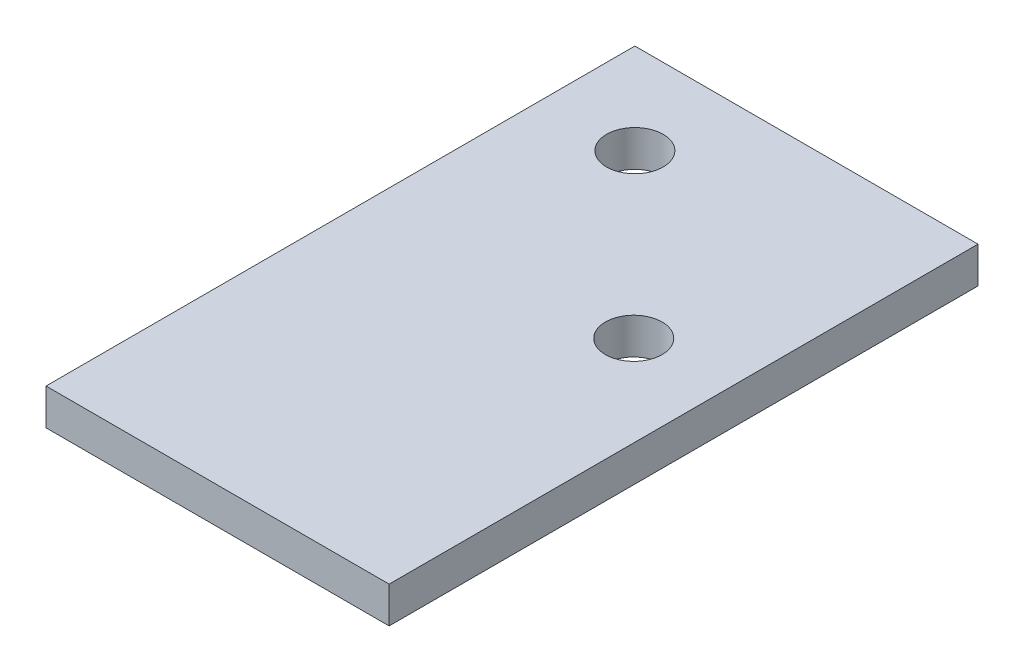
ISO-10303-21;
HEADER;
FILE_DESCRIPTION(('STEP AP214'),'2;1');
FILE_NAME('part.step','',(''),(''),'','','');
FILE_SCHEMA(('AUTOMOTIVE_DESIGN { 1 0 10303 214 1 1 1 1 }'));
ENDSEC;
DATA;
#1=APPLICATION_CONTEXT('core data for automotive mechanical design processes');
#2=APPLICATION_PROTOCOL_DEFINITION('international standard','automotive_design',2000,#1);
#3=PRODUCT_CONTEXT('',#1,'mechanical');
#4=PRODUCT('Part','Part','',(#3));
#5=PRODUCT_RELATED_PRODUCT_CATEGORY('part','',(#4));
#6=PRODUCT_DEFINITION_FORMATION('','',#4);
#7=PRODUCT_DEFINITION_CONTEXT('part definition',#1,'design');
#8=PRODUCT_DEFINITION('design','',#6,#7);
#9=PRODUCT_DEFINITION_SHAPE('','',#8);
#10=(LENGTH_UNIT() NAMED_UNIT(*) SI_UNIT(.MILLI.,.METRE.));
#11=(NAMED_UNIT(*) PLANE_ANGLE_UNIT() SI_UNIT($,.RADIAN.));
#12=(NAMED_UNIT(*) SI_UNIT($,.STERADIAN.) SOLID_ANGLE_UNIT());
#13=UNCERTAINTY_MEASURE_WITH_UNIT(LENGTH_MEASURE(1.E-05),#10,'distance_accuracy_value','');
#14=(GEOMETRIC_REPRESENTATION_CONTEXT(3) GLOBAL_UNCERTAINTY_ASSIGNED_CONTEXT((#13)) GLOBAL_UNIT_ASSIGNED_CONTEXT((#10,
#11,#12)) REPRESENTATION_CONTEXT('',''));
#15=CARTESIAN_POINT('',(0.,0.,0.));
#16=DIRECTION('',(0.,0.,1.));
#17=DIRECTION('',(1.,0.,0.));
#18=AXIS2_PLACEMENT_3D('',#15,#16,#17);
#19=CARTESIAN_POINT('',(15.15,-3.2,-26.));
#20=DIRECTION('',(1.,0.,0.));
#21=DIRECTION('',(0.,0.,-1.));
#22=AXIS2_PLACEMENT_3D('',#19,#20,#21);
#23=PLANE('',#22);
#24=DIRECTION('',(0.,0.,-1.));
#25=VECTOR('',#24,1.);
#26=CARTESIAN_POINT('',(15.15,0.,-26.));
#27=LINE('',#26,#25);
#28=CARTESIAN_POINT('',(15.15,0.,26.));
#29=VERTEX_POINT('',#28);
#30=CARTESIAN_POINT('',(15.15,0.,-26.));
#31=VERTEX_POINT('',#30);
#32=EDGE_CURVE('E122',#29,#31,#27,.T.);
#33=ORIENTED_EDGE('',*,*,#32,.F.);
#34=DIRECTION('',(0.,1.,0.));
#35=VECTOR('',#34,1.);
#36=CARTESIAN_POINT('',(15.15,-3.2,26.));
#37=LINE('',#36,#35);
#38=CARTESIAN_POINT('',(15.15,-3.2,26.));
#39=VERTEX_POINT('',#38);
#40=EDGE_CURVE('E11',#39,#29,#37,.T.);
#41=ORIENTED_EDGE('',*,*,#40,.F.);
#42=DIRECTION('',(0.,0.,-1.));
#43=VECTOR('',#42,1.);
#44=CARTESIAN_POINT('',(15.15,-3.2,-26.));
#45=LINE('',#44,#43);
#46=CARTESIAN_POINT('',(15.15,-3.2,-26.));
#47=VERTEX_POINT('',#46);
#48=EDGE_CURVE('E112',#39,#47,#45,.T.);
#49=ORIENTED_EDGE('',*,*,#48,.T.);
#50=DIRECTION('',(0.,1.,0.));
#51=VECTOR('',#50,1.);
#52=CARTESIAN_POINT('',(15.15,-3.2,-26.));
#53=LINE('',#52,#51);
#54=EDGE_CURVE('E53',#47,#31,#53,.T.);
#55=ORIENTED_EDGE('',*,*,#54,.T.);
#56=EDGE_LOOP('',(#33,#41,#49,#55));
#57=FACE_BOUND('',#56,.T.);
#58=ADVANCED_FACE('F50',(#57),#23,.T.);
#59=CARTESIAN_POINT('',(-15.15,-3.2,26.));
#60=DIRECTION('',(0.,0.,1.));
#61=DIRECTION('',(1.,0.,0.));
#62=AXIS2_PLACEMENT_3D('',#59,#60,#61);
#63=PLANE('',#62);
#64=DIRECTION('',(1.,0.,0.));
#65=VECTOR('',#64,1.);
#66=CARTESIAN_POINT('',(-15.15,0.,26.));
#67=LINE('',#66,#65);
#68=CARTESIAN_POINT('',(-15.15,0.,26.));
#69=VERTEX_POINT('',#68);
#70=EDGE_CURVE('E116',#69,#29,#67,.T.);
#71=ORIENTED_EDGE('',*,*,#70,.F.);
#72=DIRECTION('',(0.,1.,0.));
#73=VECTOR('',#72,1.);
#74=CARTESIAN_POINT('',(-15.15,-3.2,26.));
#75=LINE('',#74,#73);
#76=CARTESIAN_POINT('',(-15.15,-3.2,26.));
#77=VERTEX_POINT('',#76);
#78=EDGE_CURVE('E60',#77,#69,#75,.T.);
#79=ORIENTED_EDGE('',*,*,#78,.F.);
#80=DIRECTION('',(1.,0.,0.));
#81=VECTOR('',#80,1.);
#82=CARTESIAN_POINT('',(-15.15,-3.2,26.));
#83=LINE('',#82,#81);
#84=EDGE_CURVE('E107',#77,#39,#83,.T.);
#85=ORIENTED_EDGE('',*,*,#84,.T.);
#86=ORIENTED_EDGE('',*,*,#40,.T.);
#87=EDGE_LOOP('',(#71,#79,#85,#86));
#88=FACE_BOUND('',#87,.T.);
#89=ADVANCED_FACE('F145',(#88),#63,.T.);
#90=CARTESIAN_POINT('',(-15.15,-3.2,-26.));
#91=DIRECTION('',(-1.,0.,0.));
#92=DIRECTION('',(0.,0.,1.));
#93=AXIS2_PLACEMENT_3D('',#90,#91,#92);
#94=PLANE('',#93);
#95=DIRECTION('',(0.,0.,1.));
#96=VECTOR('',#95,1.);
#97=CARTESIAN_POINT('',(-15.15,0.,-26.));
#98=LINE('',#97,#96);
#99=CARTESIAN_POINT('',(-15.15,0.,-26.));
#100=VERTEX_POINT('',#99);
#101=EDGE_CURVE('E101',#100,#69,#98,.T.);
#102=ORIENTED_EDGE('',*,*,#101,.F.);
#103=DIRECTION('',(0.,1.,0.));
#104=VECTOR('',#103,1.);
#105=CARTESIAN_POINT('',(-15.15,-3.2,-26.));
#106=LINE('',#105,#104);
#107=CARTESIAN_POINT('',(-15.15,-3.2,-26.));
#108=VERTEX_POINT('',#107);
#109=EDGE_CURVE('E96',#108,#100,#106,.T.);
#110=ORIENTED_EDGE('',*,*,#109,.F.);
#111=DIRECTION('',(0.,0.,1.));
#112=VECTOR('',#111,1.);
#113=CARTESIAN_POINT('',(-15.15,-3.2,-26.));
#114=LINE('',#113,#112);
#115=EDGE_CURVE('E99',#108,#77,#114,.T.);
#116=ORIENTED_EDGE('',*,*,#115,.T.);
#117=ORIENTED_EDGE('',*,*,#78,.T.);
#118=EDGE_LOOP('',(#102,#110,#116,#117));
#119=FACE_BOUND('',#118,.T.);
#120=ADVANCED_FACE('F98',(#119),#94,.T.);
#121=CARTESIAN_POINT('',(-15.15,-3.2,-26.));
#122=DIRECTION('',(0.,0.,-1.));
#123=DIRECTION('',(-1.,0.,0.));
#124=AXIS2_PLACEMENT_3D('',#121,#122,#123);
#125=PLANE('',#124);
#126=DIRECTION('',(-1.,0.,0.));
#127=VECTOR('',#126,1.);
#128=CARTESIAN_POINT('',(-15.15,0.,-26.));
#129=LINE('',#128,#127);
#130=EDGE_CURVE('E126',#31,#100,#129,.T.);
#131=ORIENTED_EDGE('',*,*,#130,.F.);
#132=ORIENTED_EDGE('',*,*,#54,.F.);
#133=DIRECTION('',(-1.,0.,0.));
#134=VECTOR('',#133,1.);
#135=CARTESIAN_POINT('',(-15.15,-3.2,-26.));
#136=LINE('',#135,#134);
#137=EDGE_CURVE('E106',#47,#108,#136,.T.);
#138=ORIENTED_EDGE('',*,*,#137,.T.);
#139=ORIENTED_EDGE('',*,*,#109,.T.);
#140=EDGE_LOOP('',(#131,#132,#138,#139));
#141=FACE_BOUND('',#140,.T.);
#142=ADVANCED_FACE('F110',(#141),#125,.T.);
#143=CARTESIAN_POINT('',(0.,-3.2,0.));
#144=DIRECTION('',(0.,1.,0.));
#145=DIRECTION('',(0.,0.,1.));
#146=AXIS2_PLACEMENT_3D('',#143,#144,#145);
#147=PLANE('',#146);
#148=CARTESIAN_POINT('',(-7.15,-3.2,-18.));
#149=DIRECTION('',(0.,1.,0.));
#150=DIRECTION('',(0.,0.,1.));
#151=AXIS2_PLACEMENT_3D('',#148,#149,#150);
#152=CIRCLE('',#151,2.5);
#153=CARTESIAN_POINT('',(-7.15,-3.2,-15.5));
#154=VERTEX_POINT('',#153);
#155=EDGE_CURVE('E179',#154,#154,#152,.T.);
#156=ORIENTED_EDGE('',*,*,#155,.T.);
#157=EDGE_LOOP('',(#156));
#158=FACE_BOUND('',#157,.T.);
#159=CARTESIAN_POINT('',(7.15,-3.2,-3.59999999999999));
#160=DIRECTION('',(0.,1.,0.));
#161=DIRECTION('',(0.,0.,1.));
#162=AXIS2_PLACEMENT_3D('',#159,#160,#161);
#163=CIRCLE('',#162,2.5);
#164=CARTESIAN_POINT('',(7.15,-3.2,-1.09999999999999));
#165=VERTEX_POINT('',#164);
#166=EDGE_CURVE('E127',#165,#165,#163,.T.);
#167=ORIENTED_EDGE('',*,*,#166,.T.);
#168=EDGE_LOOP('',(#167));
#169=FACE_BOUND('',#168,.T.);
#170=ORIENTED_EDGE('',*,*,#48,.F.);
#171=ORIENTED_EDGE('',*,*,#84,.F.);
#172=ORIENTED_EDGE('',*,*,#115,.F.);
#173=ORIENTED_EDGE('',*,*,#137,.F.);
#174=EDGE_LOOP('',(#170,#171,#172,#173));
#175=FACE_BOUND('',#174,.T.);
#176=ADVANCED_FACE('F105',(#158,#169,#175),#147,.F.);
#177=CARTESIAN_POINT('',(0.,0.,0.));
#178=DIRECTION('',(0.,1.,0.));
#179=DIRECTION('',(0.,0.,1.));
#180=AXIS2_PLACEMENT_3D('',#177,#178,#179);
#181=PLANE('',#180);
#182=CARTESIAN_POINT('',(-7.15,0.,-18.));
#183=DIRECTION('',(0.,1.,0.));
#184=DIRECTION('',(0.,0.,1.));
#185=AXIS2_PLACEMENT_3D('',#182,#183,#184);
#186=CIRCLE('',#185,2.5);
#187=CARTESIAN_POINT('',(-7.15,0.,-15.5));
#188=VERTEX_POINT('',#187);
#189=EDGE_CURVE('E182',#188,#188,#186,.T.);
#190=ORIENTED_EDGE('',*,*,#189,.F.);
#191=EDGE_LOOP('',(#190));
#192=FACE_BOUND('',#191,.T.);
#193=CARTESIAN_POINT('',(7.15,0.,-3.59999999999999));
#194=DIRECTION('',(0.,1.,0.));
#195=DIRECTION('',(0.,0.,1.));
#196=AXIS2_PLACEMENT_3D('',#193,#194,#195);
#197=CIRCLE('',#196,2.5);
#198=CARTESIAN_POINT('',(7.15,0.,-1.09999999999999));
#199=VERTEX_POINT('',#198);
#200=EDGE_CURVE('E184',#199,#199,#197,.T.);
#201=ORIENTED_EDGE('',*,*,#200,.F.);
#202=EDGE_LOOP('',(#201));
#203=FACE_BOUND('',#202,.T.);
#204=ORIENTED_EDGE('',*,*,#32,.T.);
#205=ORIENTED_EDGE('',*,*,#130,.T.);
#206=ORIENTED_EDGE('',*,*,#101,.T.);
#207=ORIENTED_EDGE('',*,*,#70,.T.);
#208=EDGE_LOOP('',(#204,#205,#206,#207));
#209=FACE_BOUND('',#208,.T.);
#210=ADVANCED_FACE('F144',(#192,#203,#209),#181,.T.);
#211=CARTESIAN_POINT('',(7.15,0.,-3.59999999999999));
#212=DIRECTION('',(0.,1.,0.));
#213=DIRECTION('',(0.,0.,1.));
#214=AXIS2_PLACEMENT_3D('',#211,#212,#213);
#215=CYLINDRICAL_SURFACE('',#214,2.5);
#216=ORIENTED_EDGE('',*,*,#166,.F.);
#217=EDGE_LOOP('',(#216));
#218=FACE_BOUND('',#217,.T.);
#219=ORIENTED_EDGE('',*,*,#200,.T.);
#220=EDGE_LOOP('',(#219));
#221=FACE_BOUND('',#220,.T.);
#222=ADVANCED_FACE('F164',(#218,#221),#215,.F.);
#223=CARTESIAN_POINT('',(-7.15,0.,-18.));
#224=DIRECTION('',(0.,1.,0.));
#225=DIRECTION('',(0.,0.,1.));
#226=AXIS2_PLACEMENT_3D('',#223,#224,#225);
#227=CYLINDRICAL_SURFACE('',#226,2.5);
#228=ORIENTED_EDGE('',*,*,#155,.F.);
#229=EDGE_LOOP('',(#228));
#230=FACE_BOUND('',#229,.T.);
#231=ORIENTED_EDGE('',*,*,#189,.T.);
#232=EDGE_LOOP('',(#231));
#233=FACE_BOUND('',#232,.T.);
#234=ADVANCED_FACE('F171',(#230,#233),#227,.F.);
#235=CLOSED_SHELL('',(#58,#89,#120,#142,#176,#210,#222,#234));
#236=MANIFOLD_SOLID_BREP('B2',#235);
#237=ADVANCED_BREP_SHAPE_REPRESENTATION('',(#18,#236),#14);
#238=SHAPE_DEFINITION_REPRESENTATION(#9,#237);
ENDSEC;
END-ISO-10303-21;
